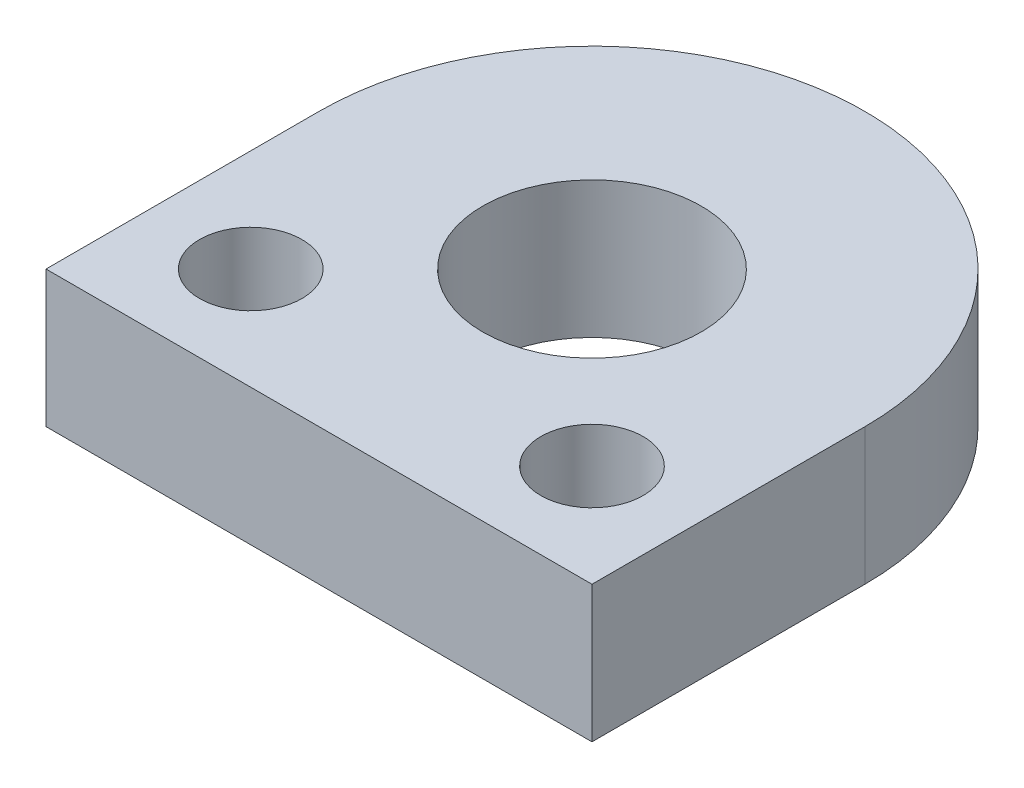
ISO-10303-21;
HEADER;
FILE_DESCRIPTION(('STEP AP214'),'2;1');
FILE_NAME('part.step','',(''),(''),'','','');
FILE_SCHEMA(('AUTOMOTIVE_DESIGN { 1 0 10303 214 1 1 1 1 }'));
ENDSEC;
DATA;
#1=APPLICATION_CONTEXT('core data for automotive mechanical design processes');
#2=APPLICATION_PROTOCOL_DEFINITION('international standard','automotive_design',2000,#1);
#3=PRODUCT_CONTEXT('',#1,'mechanical');
#4=PRODUCT('Part','Part','',(#3));
#5=PRODUCT_RELATED_PRODUCT_CATEGORY('part','',(#4));
#6=PRODUCT_DEFINITION_FORMATION('','',#4);
#7=PRODUCT_DEFINITION_CONTEXT('part definition',#1,'design');
#8=PRODUCT_DEFINITION('design','',#6,#7);
#9=PRODUCT_DEFINITION_SHAPE('','',#8);
#10=(LENGTH_UNIT() NAMED_UNIT(*) SI_UNIT(.MILLI.,.METRE.));
#11=(NAMED_UNIT(*) PLANE_ANGLE_UNIT() SI_UNIT($,.RADIAN.));
#12=(NAMED_UNIT(*) SI_UNIT($,.STERADIAN.) SOLID_ANGLE_UNIT());
#13=UNCERTAINTY_MEASURE_WITH_UNIT(LENGTH_MEASURE(1.E-05),#10,'distance_accuracy_value','');
#14=(GEOMETRIC_REPRESENTATION_CONTEXT(3) GLOBAL_UNCERTAINTY_ASSIGNED_CONTEXT((#13)) GLOBAL_UNIT_ASSIGNED_CONTEXT((#10,
#11,#12)) REPRESENTATION_CONTEXT('',''));
#15=CARTESIAN_POINT('',(0.,0.,0.));
#16=DIRECTION('',(0.,0.,1.));
#17=DIRECTION('',(1.,0.,0.));
#18=AXIS2_PLACEMENT_3D('',#15,#16,#17);
#19=CARTESIAN_POINT('',(-48.1414213562373,20.,-40.));
#20=DIRECTION('',(0.,1.,0.));
#21=DIRECTION('',(0.,0.,1.));
#22=AXIS2_PLACEMENT_3D('',#19,#20,#21);
#23=PLANE('',#22);
#24=CARTESIAN_POINT('',(40.,20.,-40.));
#25=DIRECTION('',(0.,1.,0.));
#26=DIRECTION('',(0.,0.,1.));
#27=AXIS2_PLACEMENT_3D('',#24,#25,#26);
#28=CIRCLE('',#27,40.);
#29=CARTESIAN_POINT('',(80.,20.,-40.));
#30=VERTEX_POINT('',#29);
#31=CARTESIAN_POINT('',(0.,20.,-40.));
#32=VERTEX_POINT('',#31);
#33=EDGE_CURVE('E74',#30,#32,#28,.T.);
#34=ORIENTED_EDGE('',*,*,#33,.T.);
#35=DIRECTION('',(0.,0.,-1.));
#36=VECTOR('',#35,1.);
#37=CARTESIAN_POINT('',(0.,20.,-40.));
#38=LINE('',#37,#36);
#39=CARTESIAN_POINT('',(0.,20.,0.));
#40=VERTEX_POINT('',#39);
#41=EDGE_CURVE('E82',#40,#32,#38,.T.);
#42=ORIENTED_EDGE('',*,*,#41,.F.);
#43=DIRECTION('',(1.,0.,0.));
#44=VECTOR('',#43,1.);
#45=CARTESIAN_POINT('',(-48.1414213562373,20.,0.));
#46=LINE('',#45,#44);
#47=CARTESIAN_POINT('',(80.,20.,0.));
#48=VERTEX_POINT('',#47);
#49=EDGE_CURVE('E86',#40,#48,#46,.T.);
#50=ORIENTED_EDGE('',*,*,#49,.T.);
#51=DIRECTION('',(0.,0.,-1.));
#52=VECTOR('',#51,1.);
#53=CARTESIAN_POINT('',(80.,20.,-40.));
#54=LINE('',#53,#52);
#55=EDGE_CURVE('E48',#48,#30,#54,.T.);
#56=ORIENTED_EDGE('',*,*,#55,.T.);
#57=EDGE_LOOP('',(#34,#42,#50,#56));
#58=FACE_BOUND('',#57,.T.);
#59=CARTESIAN_POINT('',(40.,20.,-40.));
#60=DIRECTION('',(0.,1.,0.));
#61=DIRECTION('',(0.,0.,1.));
#62=AXIS2_PLACEMENT_3D('',#59,#60,#61);
#63=CIRCLE('',#62,16.);
#64=CARTESIAN_POINT('',(40.,20.,-24.));
#65=VERTEX_POINT('',#64);
#66=EDGE_CURVE('E213',#65,#65,#63,.T.);
#67=ORIENTED_EDGE('',*,*,#66,.F.);
#68=EDGE_LOOP('',(#67));
#69=FACE_BOUND('',#68,.T.);
#70=CARTESIAN_POINT('',(15.,20.,-15.));
#71=DIRECTION('',(0.,1.,0.));
#72=DIRECTION('',(0.,0.,1.));
#73=AXIS2_PLACEMENT_3D('',#70,#71,#72);
#74=CIRCLE('',#73,7.5);
#75=CARTESIAN_POINT('',(15.,20.,-7.5));
#76=VERTEX_POINT('',#75);
#77=EDGE_CURVE('E207',#76,#76,#74,.T.);
#78=ORIENTED_EDGE('',*,*,#77,.F.);
#79=EDGE_LOOP('',(#78));
#80=FACE_BOUND('',#79,.T.);
#81=CARTESIAN_POINT('',(65.,20.,-15.));
#82=DIRECTION('',(0.,-1.,0.));
#83=DIRECTION('',(0.,0.,1.));
#84=AXIS2_PLACEMENT_3D('',#81,#82,#83);
#85=CIRCLE('',#84,7.5);
#86=CARTESIAN_POINT('',(65.,20.,-7.50000000000002));
#87=VERTEX_POINT('',#86);
#88=EDGE_CURVE('E204',#87,#87,#85,.T.);
#89=ORIENTED_EDGE('',*,*,#88,.T.);
#90=EDGE_LOOP('',(#89));
#91=FACE_BOUND('',#90,.T.);
#92=ADVANCED_FACE('F31',(#58,#69,#80,#91),#23,.T.);
#93=CARTESIAN_POINT('',(-48.1414213562373,0.,-40.));
#94=DIRECTION('',(0.,1.,0.));
#95=DIRECTION('',(0.,0.,1.));
#96=AXIS2_PLACEMENT_3D('',#93,#94,#95);
#97=PLANE('',#96);
#98=CARTESIAN_POINT('',(40.,0.,-40.));
#99=DIRECTION('',(0.,1.,0.));
#100=DIRECTION('',(0.,0.,1.));
#101=AXIS2_PLACEMENT_3D('',#98,#99,#100);
#102=CIRCLE('',#101,40.);
#103=CARTESIAN_POINT('',(80.,0.,-40.));
#104=VERTEX_POINT('',#103);
#105=CARTESIAN_POINT('',(0.,0.,-40.));
#106=VERTEX_POINT('',#105);
#107=EDGE_CURVE('E96',#104,#106,#102,.T.);
#108=ORIENTED_EDGE('',*,*,#107,.F.);
#109=DIRECTION('',(0.,0.,-1.));
#110=VECTOR('',#109,1.);
#111=CARTESIAN_POINT('',(80.,0.,-40.));
#112=LINE('',#111,#110);
#113=CARTESIAN_POINT('',(80.,0.,0.));
#114=VERTEX_POINT('',#113);
#115=EDGE_CURVE('E69',#114,#104,#112,.T.);
#116=ORIENTED_EDGE('',*,*,#115,.F.);
#117=DIRECTION('',(1.,0.,0.));
#118=VECTOR('',#117,1.);
#119=CARTESIAN_POINT('',(-48.1414213562373,0.,0.));
#120=LINE('',#119,#118);
#121=CARTESIAN_POINT('',(0.,0.,0.));
#122=VERTEX_POINT('',#121);
#123=EDGE_CURVE('E63',#122,#114,#120,.T.);
#124=ORIENTED_EDGE('',*,*,#123,.F.);
#125=DIRECTION('',(0.,0.,-1.));
#126=VECTOR('',#125,1.);
#127=CARTESIAN_POINT('',(0.,0.,-40.));
#128=LINE('',#127,#126);
#129=EDGE_CURVE('E84',#122,#106,#128,.T.);
#130=ORIENTED_EDGE('',*,*,#129,.T.);
#131=EDGE_LOOP('',(#108,#116,#124,#130));
#132=FACE_BOUND('',#131,.T.);
#133=CARTESIAN_POINT('',(40.,0.,-40.));
#134=DIRECTION('',(0.,1.,0.));
#135=DIRECTION('',(0.,0.,1.));
#136=AXIS2_PLACEMENT_3D('',#133,#134,#135);
#137=CIRCLE('',#136,16.);
#138=CARTESIAN_POINT('',(40.,0.,-24.));
#139=VERTEX_POINT('',#138);
#140=EDGE_CURVE('E99',#139,#139,#137,.T.);
#141=ORIENTED_EDGE('',*,*,#140,.T.);
#142=EDGE_LOOP('',(#141));
#143=FACE_BOUND('',#142,.T.);
#144=CARTESIAN_POINT('',(15.,0.,-15.));
#145=DIRECTION('',(0.,1.,0.));
#146=DIRECTION('',(0.,0.,1.));
#147=AXIS2_PLACEMENT_3D('',#144,#145,#146);
#148=CIRCLE('',#147,7.5);
#149=CARTESIAN_POINT('',(15.,0.,-7.5));
#150=VERTEX_POINT('',#149);
#151=EDGE_CURVE('E210',#150,#150,#148,.T.);
#152=ORIENTED_EDGE('',*,*,#151,.T.);
#153=EDGE_LOOP('',(#152));
#154=FACE_BOUND('',#153,.T.);
#155=CARTESIAN_POINT('',(65.,0.,-15.));
#156=DIRECTION('',(0.,-1.,0.));
#157=DIRECTION('',(0.,0.,1.));
#158=AXIS2_PLACEMENT_3D('',#155,#156,#157);
#159=CIRCLE('',#158,7.5);
#160=CARTESIAN_POINT('',(65.,0.,-7.50000000000002));
#161=VERTEX_POINT('',#160);
#162=EDGE_CURVE('E201',#161,#161,#159,.T.);
#163=ORIENTED_EDGE('',*,*,#162,.F.);
#164=EDGE_LOOP('',(#163));
#165=FACE_BOUND('',#164,.T.);
#166=ADVANCED_FACE('F107',(#132,#143,#154,#165),#97,.F.);
#167=CARTESIAN_POINT('',(40.,20.,-40.));
#168=DIRECTION('',(0.,-1.,0.));
#169=DIRECTION('',(0.,0.,-1.));
#170=AXIS2_PLACEMENT_3D('',#167,#168,#169);
#171=CYLINDRICAL_SURFACE('',#170,40.);
#172=ORIENTED_EDGE('',*,*,#107,.T.);
#173=DIRECTION('',(0.,-1.,0.));
#174=VECTOR('',#173,1.);
#175=CARTESIAN_POINT('',(0.,20.,-40.));
#176=LINE('',#175,#174);
#177=EDGE_CURVE('E11',#32,#106,#176,.T.);
#178=ORIENTED_EDGE('',*,*,#177,.F.);
#179=ORIENTED_EDGE('',*,*,#33,.F.);
#180=DIRECTION('',(0.,-1.,0.));
#181=VECTOR('',#180,1.);
#182=CARTESIAN_POINT('',(80.,20.,-40.));
#183=LINE('',#182,#181);
#184=EDGE_CURVE('E95',#30,#104,#183,.T.);
#185=ORIENTED_EDGE('',*,*,#184,.T.);
#186=EDGE_LOOP('',(#172,#178,#179,#185));
#187=FACE_BOUND('',#186,.T.);
#188=ADVANCED_FACE('F33',(#187),#171,.T.);
#189=CARTESIAN_POINT('',(0.,20.,-40.));
#190=DIRECTION('',(-1.,0.,0.));
#191=DIRECTION('',(0.,0.,1.));
#192=AXIS2_PLACEMENT_3D('',#189,#190,#191);
#193=PLANE('',#192);
#194=ORIENTED_EDGE('',*,*,#129,.F.);
#195=DIRECTION('',(0.,-1.,0.));
#196=VECTOR('',#195,1.);
#197=CARTESIAN_POINT('',(0.,20.,0.));
#198=LINE('',#197,#196);
#199=EDGE_CURVE('E40',#40,#122,#198,.T.);
#200=ORIENTED_EDGE('',*,*,#199,.F.);
#201=ORIENTED_EDGE('',*,*,#41,.T.);
#202=ORIENTED_EDGE('',*,*,#177,.T.);
#203=EDGE_LOOP('',(#194,#200,#201,#202));
#204=FACE_BOUND('',#203,.T.);
#205=ADVANCED_FACE('F81',(#204),#193,.T.);
#206=CARTESIAN_POINT('',(-48.1414213562373,20.,0.));
#207=DIRECTION('',(0.,0.,-1.));
#208=DIRECTION('',(-1.,0.,0.));
#209=AXIS2_PLACEMENT_3D('',#206,#207,#208);
#210=PLANE('',#209);
#211=ORIENTED_EDGE('',*,*,#123,.T.);
#212=DIRECTION('',(0.,-1.,0.));
#213=VECTOR('',#212,1.);
#214=CARTESIAN_POINT('',(80.,20.,0.));
#215=LINE('',#214,#213);
#216=EDGE_CURVE('E85',#48,#114,#215,.T.);
#217=ORIENTED_EDGE('',*,*,#216,.F.);
#218=ORIENTED_EDGE('',*,*,#49,.F.);
#219=ORIENTED_EDGE('',*,*,#199,.T.);
#220=EDGE_LOOP('',(#211,#217,#218,#219));
#221=FACE_BOUND('',#220,.T.);
#222=ADVANCED_FACE('F87',(#221),#210,.F.);
#223=CARTESIAN_POINT('',(80.,20.,-40.));
#224=DIRECTION('',(-1.,0.,0.));
#225=DIRECTION('',(0.,0.,1.));
#226=AXIS2_PLACEMENT_3D('',#223,#224,#225);
#227=PLANE('',#226);
#228=ORIENTED_EDGE('',*,*,#115,.T.);
#229=ORIENTED_EDGE('',*,*,#184,.F.);
#230=ORIENTED_EDGE('',*,*,#55,.F.);
#231=ORIENTED_EDGE('',*,*,#216,.T.);
#232=EDGE_LOOP('',(#228,#229,#230,#231));
#233=FACE_BOUND('',#232,.T.);
#234=ADVANCED_FACE('F104',(#233),#227,.F.);
#235=CARTESIAN_POINT('',(40.,0.,-40.));
#236=DIRECTION('',(0.,1.,0.));
#237=DIRECTION('',(0.,0.,1.));
#238=AXIS2_PLACEMENT_3D('',#235,#236,#237);
#239=CYLINDRICAL_SURFACE('',#238,16.);
#240=ORIENTED_EDGE('',*,*,#140,.F.);
#241=EDGE_LOOP('',(#240));
#242=FACE_BOUND('',#241,.T.);
#243=ORIENTED_EDGE('',*,*,#66,.T.);
#244=EDGE_LOOP('',(#243));
#245=FACE_BOUND('',#244,.T.);
#246=ADVANCED_FACE('F121',(#242,#245),#239,.F.);
#247=CARTESIAN_POINT('',(15.,0.,-15.));
#248=DIRECTION('',(0.,1.,0.));
#249=DIRECTION('',(0.,0.,1.));
#250=AXIS2_PLACEMENT_3D('',#247,#248,#249);
#251=CYLINDRICAL_SURFACE('',#250,7.5);
#252=ORIENTED_EDGE('',*,*,#151,.F.);
#253=EDGE_LOOP('',(#252));
#254=FACE_BOUND('',#253,.T.);
#255=ORIENTED_EDGE('',*,*,#77,.T.);
#256=EDGE_LOOP('',(#255));
#257=FACE_BOUND('',#256,.T.);
#258=ADVANCED_FACE('F141',(#254,#257),#251,.F.);
#259=CARTESIAN_POINT('',(65.,0.,-15.));
#260=DIRECTION('',(0.,1.,0.));
#261=DIRECTION('',(0.,0.,1.));
#262=AXIS2_PLACEMENT_3D('',#259,#260,#261);
#263=CYLINDRICAL_SURFACE('',#262,7.5);
#264=ORIENTED_EDGE('',*,*,#162,.T.);
#265=EDGE_LOOP('',(#264));
#266=FACE_BOUND('',#265,.T.);
#267=ORIENTED_EDGE('',*,*,#88,.F.);
#268=EDGE_LOOP('',(#267));
#269=FACE_BOUND('',#268,.T.);
#270=ADVANCED_FACE('F148',(#266,#269),#263,.F.);
#271=CLOSED_SHELL('',(#92,#166,#188,#205,#222,#234,#246,#258,#270));
#272=MANIFOLD_SOLID_BREP('B2',#271);
#273=ADVANCED_BREP_SHAPE_REPRESENTATION('',(#18,#272),#14);
#274=SHAPE_DEFINITION_REPRESENTATION(#9,#273);
ENDSEC;
END-ISO-10303-21;
